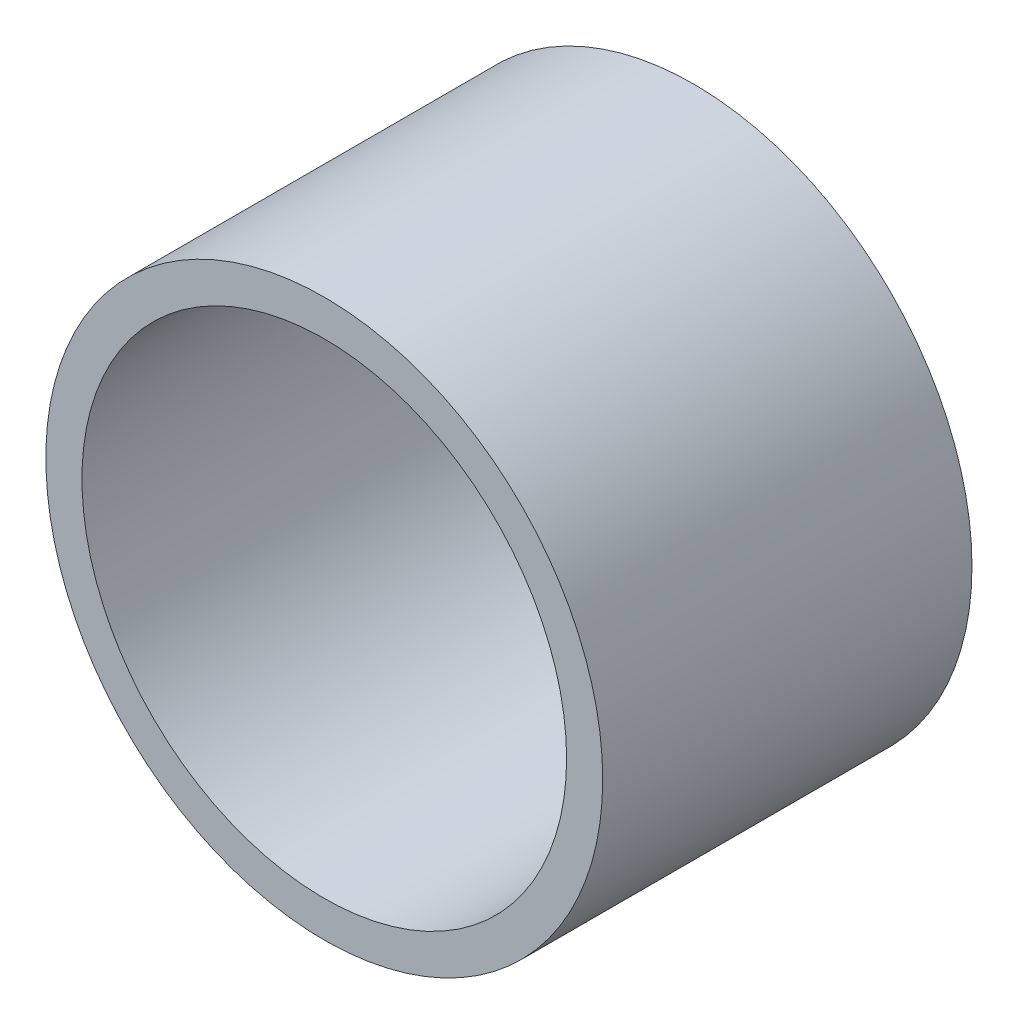
ISO-10303-21;
HEADER;
FILE_DESCRIPTION(('STEP AP214'),'2;1');
FILE_NAME('part.step','',(''),(''),'','','');
FILE_SCHEMA(('AUTOMOTIVE_DESIGN { 1 0 10303 214 1 1 1 1 }'));
ENDSEC;
DATA;
#1=APPLICATION_CONTEXT('core data for automotive mechanical design processes');
#2=APPLICATION_PROTOCOL_DEFINITION('international standard','automotive_design',2000,#1);
#3=PRODUCT_CONTEXT('',#1,'mechanical');
#4=PRODUCT('Part','Part','',(#3));
#5=PRODUCT_RELATED_PRODUCT_CATEGORY('part','',(#4));
#6=PRODUCT_DEFINITION_FORMATION('','',#4);
#7=PRODUCT_DEFINITION_CONTEXT('part definition',#1,'design');
#8=PRODUCT_DEFINITION('design','',#6,#7);
#9=PRODUCT_DEFINITION_SHAPE('','',#8);
#10=(LENGTH_UNIT() NAMED_UNIT(*) SI_UNIT(.MILLI.,.METRE.));
#11=(NAMED_UNIT(*) PLANE_ANGLE_UNIT() SI_UNIT($,.RADIAN.));
#12=(NAMED_UNIT(*) SI_UNIT($,.STERADIAN.) SOLID_ANGLE_UNIT());
#13=UNCERTAINTY_MEASURE_WITH_UNIT(LENGTH_MEASURE(1.E-05),#10,'distance_accuracy_value','');
#14=(GEOMETRIC_REPRESENTATION_CONTEXT(3) GLOBAL_UNCERTAINTY_ASSIGNED_CONTEXT((#13)) GLOBAL_UNIT_ASSIGNED_CONTEXT((#10,
#11,#12)) REPRESENTATION_CONTEXT('',''));
#15=CARTESIAN_POINT('',(0.,0.,0.));
#16=DIRECTION('',(0.,0.,1.));
#17=DIRECTION('',(1.,0.,0.));
#18=AXIS2_PLACEMENT_3D('',#15,#16,#17);
#19=CARTESIAN_POINT('',(0.,0.,20.));
#20=DIRECTION('',(0.,0.,1.));
#21=DIRECTION('',(1.,0.,0.));
#22=AXIS2_PLACEMENT_3D('',#19,#20,#21);
#23=PLANE('',#22);
#24=CARTESIAN_POINT('',(0.,0.,20.));
#25=DIRECTION('',(0.,0.,1.));
#26=DIRECTION('',(1.,0.,0.));
#27=AXIS2_PLACEMENT_3D('',#24,#25,#26);
#28=CIRCLE('',#27,30.1625);
#29=CARTESIAN_POINT('',(30.1625,0.,20.));
#30=VERTEX_POINT('',#29);
#31=EDGE_CURVE('E11',#30,#30,#28,.T.);
#32=ORIENTED_EDGE('',*,*,#31,.T.);
#33=EDGE_LOOP('',(#32));
#34=FACE_BOUND('',#33,.T.);
#35=CARTESIAN_POINT('',(0.,0.,20.));
#36=DIRECTION('',(0.,0.,1.));
#37=DIRECTION('',(1.,0.,0.));
#38=AXIS2_PLACEMENT_3D('',#35,#36,#37);
#39=CIRCLE('',#38,26.2509);
#40=CARTESIAN_POINT('',(26.2509,0.,20.));
#41=VERTEX_POINT('',#40);
#42=EDGE_CURVE('E56',#41,#41,#39,.T.);
#43=ORIENTED_EDGE('',*,*,#42,.F.);
#44=EDGE_LOOP('',(#43));
#45=FACE_BOUND('',#44,.T.);
#46=ADVANCED_FACE('F43',(#34,#45),#23,.T.);
#47=CARTESIAN_POINT('',(0.,0.,-20.));
#48=DIRECTION('',(0.,0.,1.));
#49=DIRECTION('',(1.,0.,0.));
#50=AXIS2_PLACEMENT_3D('',#47,#48,#49);
#51=PLANE('',#50);
#52=CARTESIAN_POINT('',(0.,0.,-20.));
#53=DIRECTION('',(0.,0.,1.));
#54=DIRECTION('',(1.,0.,0.));
#55=AXIS2_PLACEMENT_3D('',#52,#53,#54);
#56=CIRCLE('',#55,30.1625);
#57=CARTESIAN_POINT('',(30.1625,0.,-20.));
#58=VERTEX_POINT('',#57);
#59=EDGE_CURVE('E47',#58,#58,#56,.T.);
#60=ORIENTED_EDGE('',*,*,#59,.F.);
#61=EDGE_LOOP('',(#60));
#62=FACE_BOUND('',#61,.T.);
#63=CARTESIAN_POINT('',(0.,0.,-20.));
#64=DIRECTION('',(0.,0.,1.));
#65=DIRECTION('',(1.,0.,0.));
#66=AXIS2_PLACEMENT_3D('',#63,#64,#65);
#67=CIRCLE('',#66,26.2509);
#68=CARTESIAN_POINT('',(26.2509,0.,-20.));
#69=VERTEX_POINT('',#68);
#70=EDGE_CURVE('E58',#69,#69,#67,.T.);
#71=ORIENTED_EDGE('',*,*,#70,.T.);
#72=EDGE_LOOP('',(#71));
#73=FACE_BOUND('',#72,.T.);
#74=ADVANCED_FACE('F70',(#62,#73),#51,.F.);
#75=CARTESIAN_POINT('',(0.,0.,20.));
#76=DIRECTION('',(0.,0.,-1.));
#77=DIRECTION('',(-1.,0.,0.));
#78=AXIS2_PLACEMENT_3D('',#75,#76,#77);
#79=CYLINDRICAL_SURFACE('',#78,30.1625);
#80=ORIENTED_EDGE('',*,*,#31,.F.);
#81=EDGE_LOOP('',(#80));
#82=FACE_BOUND('',#81,.T.);
#83=ORIENTED_EDGE('',*,*,#59,.T.);
#84=EDGE_LOOP('',(#83));
#85=FACE_BOUND('',#84,.T.);
#86=ADVANCED_FACE('F45',(#82,#85),#79,.T.);
#87=CARTESIAN_POINT('',(0.,0.,20.));
#88=DIRECTION('',(0.,0.,-1.));
#89=DIRECTION('',(-1.,0.,0.));
#90=AXIS2_PLACEMENT_3D('',#87,#88,#89);
#91=CYLINDRICAL_SURFACE('',#90,26.2509);
#92=ORIENTED_EDGE('',*,*,#42,.T.);
#93=EDGE_LOOP('',(#92));
#94=FACE_BOUND('',#93,.T.);
#95=ORIENTED_EDGE('',*,*,#70,.F.);
#96=EDGE_LOOP('',(#95));
#97=FACE_BOUND('',#96,.T.);
#98=ADVANCED_FACE('F66',(#94,#97),#91,.F.);
#99=CLOSED_SHELL('',(#46,#74,#86,#98));
#100=MANIFOLD_SOLID_BREP('B2',#99);
#101=ADVANCED_BREP_SHAPE_REPRESENTATION('',(#18,#100),#14);
#102=SHAPE_DEFINITION_REPRESENTATION(#9,#101);
ENDSEC;
END-ISO-10303-21;
